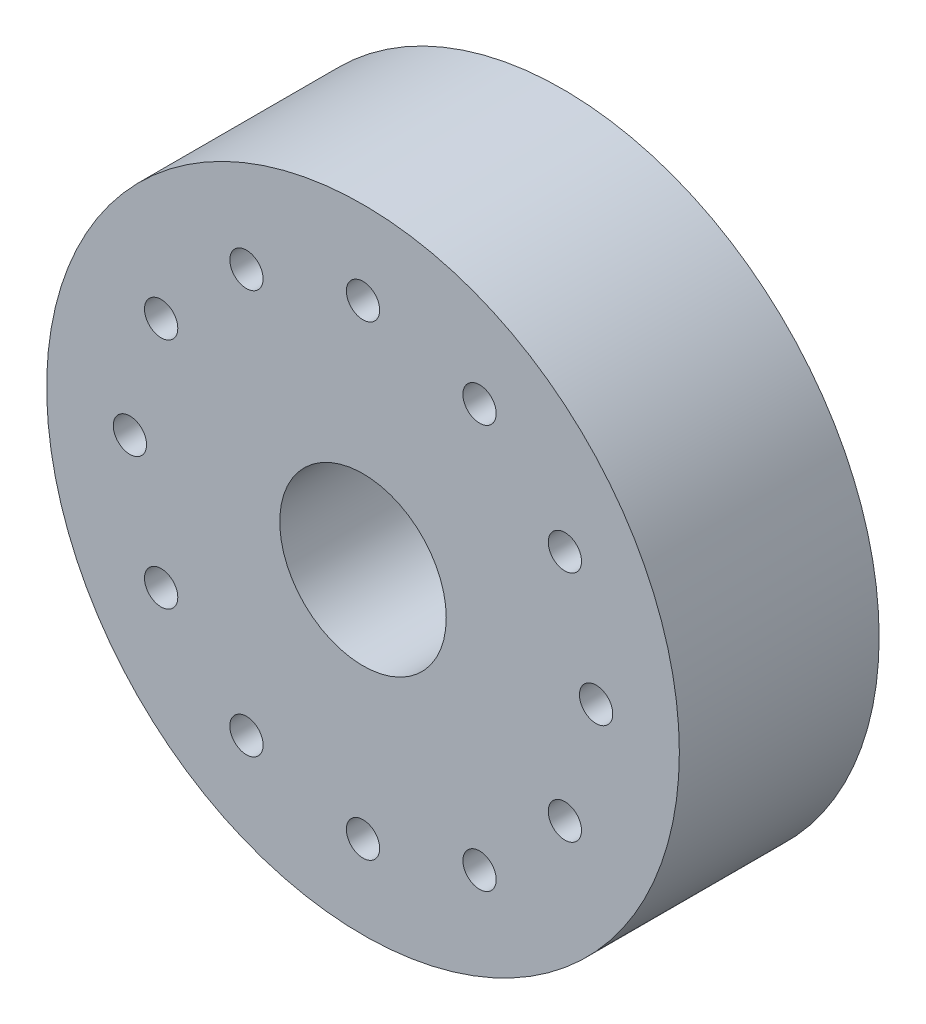
ISO-10303-21;
HEADER;
FILE_DESCRIPTION(('STEP AP214'),'2;1');
FILE_NAME('part.step','',(''),(''),'','','');
FILE_SCHEMA(('AUTOMOTIVE_DESIGN { 1 0 10303 214 1 1 1 1 }'));
ENDSEC;
DATA;
#1=APPLICATION_CONTEXT('core data for automotive mechanical design processes');
#2=APPLICATION_PROTOCOL_DEFINITION('international standard','automotive_design',2000,#1);
#3=PRODUCT_CONTEXT('',#1,'mechanical');
#4=PRODUCT('Part','Part','',(#3));
#5=PRODUCT_RELATED_PRODUCT_CATEGORY('part','',(#4));
#6=PRODUCT_DEFINITION_FORMATION('','',#4);
#7=PRODUCT_DEFINITION_CONTEXT('part definition',#1,'design');
#8=PRODUCT_DEFINITION('design','',#6,#7);
#9=PRODUCT_DEFINITION_SHAPE('','',#8);
#10=(LENGTH_UNIT() NAMED_UNIT(*) SI_UNIT(.MILLI.,.METRE.));
#11=(NAMED_UNIT(*) PLANE_ANGLE_UNIT() SI_UNIT($,.RADIAN.));
#12=(NAMED_UNIT(*) SI_UNIT($,.STERADIAN.) SOLID_ANGLE_UNIT());
#13=UNCERTAINTY_MEASURE_WITH_UNIT(LENGTH_MEASURE(1.E-05),#10,'distance_accuracy_value','');
#14=(GEOMETRIC_REPRESENTATION_CONTEXT(3) GLOBAL_UNCERTAINTY_ASSIGNED_CONTEXT((#13)) GLOBAL_UNIT_ASSIGNED_CONTEXT((#10,
#11,#12)) REPRESENTATION_CONTEXT('',''));
#15=CARTESIAN_POINT('',(0.,0.,0.));
#16=DIRECTION('',(0.,0.,1.));
#17=DIRECTION('',(1.,0.,0.));
#18=AXIS2_PLACEMENT_3D('',#15,#16,#17);
#19=CARTESIAN_POINT('',(0.,0.,6.));
#20=DIRECTION('',(0.,0.,1.));
#21=DIRECTION('',(1.,0.,0.));
#22=AXIS2_PLACEMENT_3D('',#19,#20,#21);
#23=PLANE('',#22);
#24=CARTESIAN_POINT('',(-6.06217782648988,3.49999999999793,6.));
#25=DIRECTION('',(0.,0.,1.));
#26=DIRECTION('',(1.,0.,0.));
#27=AXIS2_PLACEMENT_3D('',#24,#25,#26);
#28=CIRCLE('',#27,0.500000000001829);
#29=CARTESIAN_POINT('',(-5.56217782648805,3.49999999999793,6.));
#30=VERTEX_POINT('',#29);
#31=EDGE_CURVE('E107',#30,#30,#28,.T.);
#32=ORIENTED_EDGE('',*,*,#31,.F.);
#33=EDGE_LOOP('',(#32));
#34=FACE_BOUND('',#33,.T.);
#35=CARTESIAN_POINT('',(-6.06217782648749,-3.50000000000207,6.));
#36=DIRECTION('',(0.,0.,1.));
#37=DIRECTION('',(1.,0.,0.));
#38=AXIS2_PLACEMENT_3D('',#35,#36,#37);
#39=CIRCLE('',#38,0.500000000004095);
#40=CARTESIAN_POINT('',(-5.56217782648339,-3.50000000000207,6.));
#41=VERTEX_POINT('',#40);
#42=EDGE_CURVE('E95',#41,#41,#39,.T.);
#43=ORIENTED_EDGE('',*,*,#42,.F.);
#44=EDGE_LOOP('',(#43));
#45=FACE_BOUND('',#44,.T.);
#46=CARTESIAN_POINT('',(4.77313267878907E-12,-7.,6.));
#47=DIRECTION('',(0.,0.,1.));
#48=DIRECTION('',(1.,0.,0.));
#49=AXIS2_PLACEMENT_3D('',#46,#47,#48);
#50=CIRCLE('',#49,0.500000000004612);
#51=CARTESIAN_POINT('',(0.500000000009385,-7.,6.));
#52=VERTEX_POINT('',#51);
#53=EDGE_CURVE('E83',#52,#52,#50,.T.);
#54=ORIENTED_EDGE('',*,*,#53,.F.);
#55=EDGE_LOOP('',(#54));
#56=FACE_BOUND('',#55,.T.);
#57=CARTESIAN_POINT('',(6.06217782649465,-3.49999999999793,6.));
#58=DIRECTION('',(0.,0.,1.));
#59=DIRECTION('',(1.,0.,0.));
#60=AXIS2_PLACEMENT_3D('',#57,#58,#59);
#61=CIRCLE('',#60,0.500000000002852);
#62=CARTESIAN_POINT('',(6.5621778264975,-3.49999999999793,6.));
#63=VERTEX_POINT('',#62);
#64=EDGE_CURVE('E71',#63,#63,#61,.T.);
#65=ORIENTED_EDGE('',*,*,#64,.F.);
#66=EDGE_LOOP('',(#65));
#67=FACE_BOUND('',#66,.T.);
#68=CARTESIAN_POINT('',(6.06217782649226,3.50000000000207,6.));
#69=DIRECTION('',(0.,0.,1.));
#70=DIRECTION('',(1.,0.,0.));
#71=AXIS2_PLACEMENT_3D('',#68,#69,#70);
#72=CIRCLE('',#71,0.500000000000553);
#73=CARTESIAN_POINT('',(6.56217782649282,3.50000000000207,6.));
#74=VERTEX_POINT('',#73);
#75=EDGE_CURVE('E59',#74,#74,#72,.T.);
#76=ORIENTED_EDGE('',*,*,#75,.F.);
#77=EDGE_LOOP('',(#76));
#78=FACE_BOUND('',#77,.T.);
#79=CARTESIAN_POINT('',(0.,7.,6.));
#80=DIRECTION('',(0.,0.,1.));
#81=DIRECTION('',(1.,0.,0.));
#82=AXIS2_PLACEMENT_3D('',#79,#80,#81);
#83=CIRCLE('',#82,0.5);
#84=CARTESIAN_POINT('',(0.5,7.,6.));
#85=VERTEX_POINT('',#84);
#86=EDGE_CURVE('E47',#85,#85,#83,.T.);
#87=ORIENTED_EDGE('',*,*,#86,.F.);
#88=EDGE_LOOP('',(#87));
#89=FACE_BOUND('',#88,.T.);
#90=CARTESIAN_POINT('',(0.,0.,6.));
#91=DIRECTION('',(0.,0.,1.));
#92=DIRECTION('',(1.,0.,0.));
#93=AXIS2_PLACEMENT_3D('',#90,#91,#92);
#94=CIRCLE('',#93,9.5);
#95=CARTESIAN_POINT('',(9.5,0.,6.));
#96=VERTEX_POINT('',#95);
#97=EDGE_CURVE('E10',#96,#96,#94,.T.);
#98=ORIENTED_EDGE('',*,*,#97,.T.);
#99=EDGE_LOOP('',(#98));
#100=FACE_BOUND('',#99,.T.);
#101=CARTESIAN_POINT('',(0.,0.,6.));
#102=DIRECTION('',(0.,0.,1.));
#103=DIRECTION('',(1.,0.,0.));
#104=AXIS2_PLACEMENT_3D('',#101,#102,#103);
#105=CIRCLE('',#104,2.5);
#106=CARTESIAN_POINT('',(2.5,0.,6.));
#107=VERTEX_POINT('',#106);
#108=EDGE_CURVE('E42',#107,#107,#105,.T.);
#109=ORIENTED_EDGE('',*,*,#108,.F.);
#110=EDGE_LOOP('',(#109));
#111=FACE_BOUND('',#110,.T.);
#112=CARTESIAN_POINT('',(3.50000000000032,6.06217782649226,6.));
#113=DIRECTION('',(0.,0.,1.));
#114=DIRECTION('',(1.,0.,0.));
#115=AXIS2_PLACEMENT_3D('',#112,#113,#114);
#116=CIRCLE('',#115,0.499999999999963);
#117=CARTESIAN_POINT('',(4.00000000000028,6.06217782649226,6.));
#118=VERTEX_POINT('',#117);
#119=EDGE_CURVE('E53',#118,#118,#116,.T.);
#120=ORIENTED_EDGE('',*,*,#119,.F.);
#121=EDGE_LOOP('',(#120));
#122=FACE_BOUND('',#121,.T.);
#123=CARTESIAN_POINT('',(7.00000000000239,2.38656633939453E-12,6.));
#124=DIRECTION('',(0.,0.,1.));
#125=DIRECTION('',(1.,0.,0.));
#126=AXIS2_PLACEMENT_3D('',#123,#124,#125);
#127=CIRCLE('',#126,0.500000000001608);
#128=CARTESIAN_POINT('',(7.500000000004,2.38656633939453E-12,6.));
#129=VERTEX_POINT('',#128);
#130=EDGE_CURVE('E65',#129,#129,#127,.T.);
#131=ORIENTED_EDGE('',*,*,#130,.F.);
#132=EDGE_LOOP('',(#131));
#133=FACE_BOUND('',#132,.T.);
#134=CARTESIAN_POINT('',(3.50000000000445,-6.06217782648988,6.));
#135=DIRECTION('',(0.,0.,1.));
#136=DIRECTION('',(1.,0.,0.));
#137=AXIS2_PLACEMENT_3D('',#134,#135,#136);
#138=CIRCLE('',#137,0.500000000003953);
#139=CARTESIAN_POINT('',(4.00000000000841,-6.06217782648988,6.));
#140=VERTEX_POINT('',#139);
#141=EDGE_CURVE('E77',#140,#140,#138,.T.);
#142=ORIENTED_EDGE('',*,*,#141,.F.);
#143=EDGE_LOOP('',(#142));
#144=FACE_BOUND('',#143,.T.);
#145=CARTESIAN_POINT('',(-3.49999999999555,-6.06217782649226,6.));
#146=DIRECTION('',(0.,0.,1.));
#147=DIRECTION('',(1.,0.,0.));
#148=AXIS2_PLACEMENT_3D('',#145,#146,#147);
#149=CIRCLE('',#148,0.500000000004664);
#150=CARTESIAN_POINT('',(-2.99999999999088,-6.06217782649226,6.));
#151=VERTEX_POINT('',#150);
#152=EDGE_CURVE('E89',#151,#151,#149,.T.);
#153=ORIENTED_EDGE('',*,*,#152,.F.);
#154=EDGE_LOOP('',(#153));
#155=FACE_BOUND('',#154,.T.);
#156=CARTESIAN_POINT('',(-6.99999999999761,-2.38742359215394E-12,6.));
#157=DIRECTION('',(0.,0.,1.));
#158=DIRECTION('',(1.,0.,0.));
#159=AXIS2_PLACEMENT_3D('',#156,#157,#158);
#160=CIRCLE('',#159,0.500000000003051);
#161=CARTESIAN_POINT('',(-6.49999999999456,-2.38742359215394E-12,6.));
#162=VERTEX_POINT('',#161);
#163=EDGE_CURVE('E101',#162,#162,#160,.T.);
#164=ORIENTED_EDGE('',*,*,#163,.F.);
#165=EDGE_LOOP('',(#164));
#166=FACE_BOUND('',#165,.T.);
#167=CARTESIAN_POINT('',(-3.49999999999968,6.06217782648987,6.));
#168=DIRECTION('',(0.,0.,1.));
#169=DIRECTION('',(1.,0.,0.));
#170=AXIS2_PLACEMENT_3D('',#167,#168,#169);
#171=CIRCLE('',#170,0.500000000000745);
#172=CARTESIAN_POINT('',(-2.99999999999894,6.06217782648987,6.));
#173=VERTEX_POINT('',#172);
#174=EDGE_CURVE('E113',#173,#173,#171,.T.);
#175=ORIENTED_EDGE('',*,*,#174,.F.);
#176=EDGE_LOOP('',(#175));
#177=FACE_BOUND('',#176,.T.);
#178=ADVANCED_FACE('F31',(#34,#45,#56,#67,#78,#89,#100,#111,#122,#133,#144,#155,#166,#177),#23,.T.);
#179=CARTESIAN_POINT('',(0.,0.,0.));
#180=DIRECTION('',(0.,0.,1.));
#181=DIRECTION('',(1.,0.,0.));
#182=AXIS2_PLACEMENT_3D('',#179,#180,#181);
#183=PLANE('',#182);
#184=CARTESIAN_POINT('',(-6.06217782648988,3.49999999999793,0.));
#185=DIRECTION('',(0.,0.,1.));
#186=DIRECTION('',(1.,0.,0.));
#187=AXIS2_PLACEMENT_3D('',#184,#185,#186);
#188=CIRCLE('',#187,0.500000000001829);
#189=CARTESIAN_POINT('',(-5.56217782648805,3.49999999999793,0.));
#190=VERTEX_POINT('',#189);
#191=EDGE_CURVE('E110',#190,#190,#188,.T.);
#192=ORIENTED_EDGE('',*,*,#191,.T.);
#193=EDGE_LOOP('',(#192));
#194=FACE_BOUND('',#193,.T.);
#195=CARTESIAN_POINT('',(-6.06217782648749,-3.50000000000207,0.));
#196=DIRECTION('',(0.,0.,1.));
#197=DIRECTION('',(1.,0.,0.));
#198=AXIS2_PLACEMENT_3D('',#195,#196,#197);
#199=CIRCLE('',#198,0.500000000004095);
#200=CARTESIAN_POINT('',(-5.56217782648339,-3.50000000000207,0.));
#201=VERTEX_POINT('',#200);
#202=EDGE_CURVE('E98',#201,#201,#199,.T.);
#203=ORIENTED_EDGE('',*,*,#202,.T.);
#204=EDGE_LOOP('',(#203));
#205=FACE_BOUND('',#204,.T.);
#206=CARTESIAN_POINT('',(4.77313267878907E-12,-7.,0.));
#207=DIRECTION('',(0.,0.,1.));
#208=DIRECTION('',(1.,0.,0.));
#209=AXIS2_PLACEMENT_3D('',#206,#207,#208);
#210=CIRCLE('',#209,0.500000000004612);
#211=CARTESIAN_POINT('',(0.500000000009385,-7.,0.));
#212=VERTEX_POINT('',#211);
#213=EDGE_CURVE('E86',#212,#212,#210,.T.);
#214=ORIENTED_EDGE('',*,*,#213,.T.);
#215=EDGE_LOOP('',(#214));
#216=FACE_BOUND('',#215,.T.);
#217=CARTESIAN_POINT('',(6.06217782649465,-3.49999999999793,0.));
#218=DIRECTION('',(0.,0.,1.));
#219=DIRECTION('',(1.,0.,0.));
#220=AXIS2_PLACEMENT_3D('',#217,#218,#219);
#221=CIRCLE('',#220,0.500000000002852);
#222=CARTESIAN_POINT('',(6.5621778264975,-3.49999999999793,0.));
#223=VERTEX_POINT('',#222);
#224=EDGE_CURVE('E74',#223,#223,#221,.T.);
#225=ORIENTED_EDGE('',*,*,#224,.T.);
#226=EDGE_LOOP('',(#225));
#227=FACE_BOUND('',#226,.T.);
#228=CARTESIAN_POINT('',(6.06217782649226,3.50000000000207,0.));
#229=DIRECTION('',(0.,0.,1.));
#230=DIRECTION('',(1.,0.,0.));
#231=AXIS2_PLACEMENT_3D('',#228,#229,#230);
#232=CIRCLE('',#231,0.500000000000553);
#233=CARTESIAN_POINT('',(6.56217782649282,3.50000000000207,0.));
#234=VERTEX_POINT('',#233);
#235=EDGE_CURVE('E62',#234,#234,#232,.T.);
#236=ORIENTED_EDGE('',*,*,#235,.T.);
#237=EDGE_LOOP('',(#236));
#238=FACE_BOUND('',#237,.T.);
#239=CARTESIAN_POINT('',(0.,7.,0.));
#240=DIRECTION('',(0.,0.,1.));
#241=DIRECTION('',(1.,0.,0.));
#242=AXIS2_PLACEMENT_3D('',#239,#240,#241);
#243=CIRCLE('',#242,0.5);
#244=CARTESIAN_POINT('',(0.5,7.,0.));
#245=VERTEX_POINT('',#244);
#246=EDGE_CURVE('E50',#245,#245,#243,.T.);
#247=ORIENTED_EDGE('',*,*,#246,.T.);
#248=EDGE_LOOP('',(#247));
#249=FACE_BOUND('',#248,.T.);
#250=CARTESIAN_POINT('',(0.,0.,0.));
#251=DIRECTION('',(0.,0.,1.));
#252=DIRECTION('',(1.,0.,0.));
#253=AXIS2_PLACEMENT_3D('',#250,#251,#252);
#254=CIRCLE('',#253,9.5);
#255=CARTESIAN_POINT('',(9.5,0.,0.));
#256=VERTEX_POINT('',#255);
#257=EDGE_CURVE('E35',#256,#256,#254,.T.);
#258=ORIENTED_EDGE('',*,*,#257,.F.);
#259=EDGE_LOOP('',(#258));
#260=FACE_BOUND('',#259,.T.);
#261=CARTESIAN_POINT('',(0.,0.,0.));
#262=DIRECTION('',(0.,0.,1.));
#263=DIRECTION('',(1.,0.,0.));
#264=AXIS2_PLACEMENT_3D('',#261,#262,#263);
#265=CIRCLE('',#264,2.5);
#266=CARTESIAN_POINT('',(2.5,0.,0.));
#267=VERTEX_POINT('',#266);
#268=EDGE_CURVE('E44',#267,#267,#265,.T.);
#269=ORIENTED_EDGE('',*,*,#268,.T.);
#270=EDGE_LOOP('',(#269));
#271=FACE_BOUND('',#270,.T.);
#272=CARTESIAN_POINT('',(3.50000000000032,6.06217782649226,0.));
#273=DIRECTION('',(0.,0.,1.));
#274=DIRECTION('',(1.,0.,0.));
#275=AXIS2_PLACEMENT_3D('',#272,#273,#274);
#276=CIRCLE('',#275,0.499999999999963);
#277=CARTESIAN_POINT('',(4.00000000000028,6.06217782649226,0.));
#278=VERTEX_POINT('',#277);
#279=EDGE_CURVE('E56',#278,#278,#276,.T.);
#280=ORIENTED_EDGE('',*,*,#279,.T.);
#281=EDGE_LOOP('',(#280));
#282=FACE_BOUND('',#281,.T.);
#283=CARTESIAN_POINT('',(7.00000000000239,2.38656633939453E-12,0.));
#284=DIRECTION('',(0.,0.,1.));
#285=DIRECTION('',(1.,0.,0.));
#286=AXIS2_PLACEMENT_3D('',#283,#284,#285);
#287=CIRCLE('',#286,0.500000000001608);
#288=CARTESIAN_POINT('',(7.500000000004,2.38656633939453E-12,0.));
#289=VERTEX_POINT('',#288);
#290=EDGE_CURVE('E68',#289,#289,#287,.T.);
#291=ORIENTED_EDGE('',*,*,#290,.T.);
#292=EDGE_LOOP('',(#291));
#293=FACE_BOUND('',#292,.T.);
#294=CARTESIAN_POINT('',(3.50000000000445,-6.06217782648988,0.));
#295=DIRECTION('',(0.,0.,1.));
#296=DIRECTION('',(1.,0.,0.));
#297=AXIS2_PLACEMENT_3D('',#294,#295,#296);
#298=CIRCLE('',#297,0.500000000003953);
#299=CARTESIAN_POINT('',(4.00000000000841,-6.06217782648988,0.));
#300=VERTEX_POINT('',#299);
#301=EDGE_CURVE('E80',#300,#300,#298,.T.);
#302=ORIENTED_EDGE('',*,*,#301,.T.);
#303=EDGE_LOOP('',(#302));
#304=FACE_BOUND('',#303,.T.);
#305=CARTESIAN_POINT('',(-3.49999999999555,-6.06217782649226,0.));
#306=DIRECTION('',(0.,0.,1.));
#307=DIRECTION('',(1.,0.,0.));
#308=AXIS2_PLACEMENT_3D('',#305,#306,#307);
#309=CIRCLE('',#308,0.500000000004664);
#310=CARTESIAN_POINT('',(-2.99999999999088,-6.06217782649226,0.));
#311=VERTEX_POINT('',#310);
#312=EDGE_CURVE('E92',#311,#311,#309,.T.);
#313=ORIENTED_EDGE('',*,*,#312,.T.);
#314=EDGE_LOOP('',(#313));
#315=FACE_BOUND('',#314,.T.);
#316=CARTESIAN_POINT('',(-6.99999999999761,-2.38742359215394E-12,0.));
#317=DIRECTION('',(0.,0.,1.));
#318=DIRECTION('',(1.,0.,0.));
#319=AXIS2_PLACEMENT_3D('',#316,#317,#318);
#320=CIRCLE('',#319,0.500000000003051);
#321=CARTESIAN_POINT('',(-6.49999999999456,-2.38742359215394E-12,0.));
#322=VERTEX_POINT('',#321);
#323=EDGE_CURVE('E104',#322,#322,#320,.T.);
#324=ORIENTED_EDGE('',*,*,#323,.T.);
#325=EDGE_LOOP('',(#324));
#326=FACE_BOUND('',#325,.T.);
#327=CARTESIAN_POINT('',(-3.49999999999968,6.06217782648987,0.));
#328=DIRECTION('',(0.,0.,1.));
#329=DIRECTION('',(1.,0.,0.));
#330=AXIS2_PLACEMENT_3D('',#327,#328,#329);
#331=CIRCLE('',#330,0.500000000000745);
#332=CARTESIAN_POINT('',(-2.99999999999894,6.06217782648987,0.));
#333=VERTEX_POINT('',#332);
#334=EDGE_CURVE('E116',#333,#333,#331,.T.);
#335=ORIENTED_EDGE('',*,*,#334,.T.);
#336=EDGE_LOOP('',(#335));
#337=FACE_BOUND('',#336,.T.);
#338=ADVANCED_FACE('F126',(#194,#205,#216,#227,#238,#249,#260,#271,#282,#293,#304,#315,#326,
#337),#183,.F.);
#339=CARTESIAN_POINT('',(0.,0.,6.));
#340=DIRECTION('',(0.,0.,-1.));
#341=DIRECTION('',(-1.,0.,0.));
#342=AXIS2_PLACEMENT_3D('',#339,#340,#341);
#343=CYLINDRICAL_SURFACE('',#342,9.5);
#344=ORIENTED_EDGE('',*,*,#97,.F.);
#345=EDGE_LOOP('',(#344));
#346=FACE_BOUND('',#345,.T.);
#347=ORIENTED_EDGE('',*,*,#257,.T.);
#348=EDGE_LOOP('',(#347));
#349=FACE_BOUND('',#348,.T.);
#350=ADVANCED_FACE('F33',(#346,#349),#343,.T.);
#351=CARTESIAN_POINT('',(0.,0.,6.));
#352=DIRECTION('',(0.,0.,-1.));
#353=DIRECTION('',(-1.,0.,0.));
#354=AXIS2_PLACEMENT_3D('',#351,#352,#353);
#355=CYLINDRICAL_SURFACE('',#354,2.5);
#356=ORIENTED_EDGE('',*,*,#108,.T.);
#357=EDGE_LOOP('',(#356));
#358=FACE_BOUND('',#357,.T.);
#359=ORIENTED_EDGE('',*,*,#268,.F.);
#360=EDGE_LOOP('',(#359));
#361=FACE_BOUND('',#360,.T.);
#362=ADVANCED_FACE('F136',(#358,#361),#355,.F.);
#363=CARTESIAN_POINT('',(0.,7.,6.));
#364=DIRECTION('',(0.,0.,-1.));
#365=DIRECTION('',(-1.,0.,0.));
#366=AXIS2_PLACEMENT_3D('',#363,#364,#365);
#367=CYLINDRICAL_SURFACE('',#366,0.5);
#368=ORIENTED_EDGE('',*,*,#86,.T.);
#369=EDGE_LOOP('',(#368));
#370=FACE_BOUND('',#369,.T.);
#371=ORIENTED_EDGE('',*,*,#246,.F.);
#372=EDGE_LOOP('',(#371));
#373=FACE_BOUND('',#372,.T.);
#374=ADVANCED_FACE('F139',(#370,#373),#367,.F.);
#375=CARTESIAN_POINT('',(3.50000000000032,6.06217782649226,6.));
#376=DIRECTION('',(0.,0.,-1.));
#377=DIRECTION('',(-1.,0.,0.));
#378=AXIS2_PLACEMENT_3D('',#375,#376,#377);
#379=CYLINDRICAL_SURFACE('',#378,0.499999999999963);
#380=ORIENTED_EDGE('',*,*,#119,.T.);
#381=EDGE_LOOP('',(#380));
#382=FACE_BOUND('',#381,.T.);
#383=ORIENTED_EDGE('',*,*,#279,.F.);
#384=EDGE_LOOP('',(#383));
#385=FACE_BOUND('',#384,.T.);
#386=ADVANCED_FACE('F143',(#382,#385),#379,.F.);
#387=CARTESIAN_POINT('',(6.06217782649226,3.50000000000207,6.));
#388=DIRECTION('',(0.,0.,-1.));
#389=DIRECTION('',(-1.,0.,0.));
#390=AXIS2_PLACEMENT_3D('',#387,#388,#389);
#391=CYLINDRICAL_SURFACE('',#390,0.500000000000553);
#392=ORIENTED_EDGE('',*,*,#75,.T.);
#393=EDGE_LOOP('',(#392));
#394=FACE_BOUND('',#393,.T.);
#395=ORIENTED_EDGE('',*,*,#235,.F.);
#396=EDGE_LOOP('',(#395));
#397=FACE_BOUND('',#396,.T.);
#398=ADVANCED_FACE('F147',(#394,#397),#391,.F.);
#399=CARTESIAN_POINT('',(7.00000000000239,2.38656633939453E-12,6.));
#400=DIRECTION('',(0.,0.,-1.));
#401=DIRECTION('',(-1.,0.,0.));
#402=AXIS2_PLACEMENT_3D('',#399,#400,#401);
#403=CYLINDRICAL_SURFACE('',#402,0.500000000001608);
#404=ORIENTED_EDGE('',*,*,#130,.T.);
#405=EDGE_LOOP('',(#404));
#406=FACE_BOUND('',#405,.T.);
#407=ORIENTED_EDGE('',*,*,#290,.F.);
#408=EDGE_LOOP('',(#407));
#409=FACE_BOUND('',#408,.T.);
#410=ADVANCED_FACE('F151',(#406,#409),#403,.F.);
#411=CARTESIAN_POINT('',(6.06217782649465,-3.49999999999793,6.));
#412=DIRECTION('',(0.,0.,-1.));
#413=DIRECTION('',(-1.,0.,0.));
#414=AXIS2_PLACEMENT_3D('',#411,#412,#413);
#415=CYLINDRICAL_SURFACE('',#414,0.500000000002852);
#416=ORIENTED_EDGE('',*,*,#64,.T.);
#417=EDGE_LOOP('',(#416));
#418=FACE_BOUND('',#417,.T.);
#419=ORIENTED_EDGE('',*,*,#224,.F.);
#420=EDGE_LOOP('',(#419));
#421=FACE_BOUND('',#420,.T.);
#422=ADVANCED_FACE('F155',(#418,#421),#415,.F.);
#423=CARTESIAN_POINT('',(3.50000000000445,-6.06217782648988,6.));
#424=DIRECTION('',(0.,0.,-1.));
#425=DIRECTION('',(-1.,0.,0.));
#426=AXIS2_PLACEMENT_3D('',#423,#424,#425);
#427=CYLINDRICAL_SURFACE('',#426,0.500000000003953);
#428=ORIENTED_EDGE('',*,*,#141,.T.);
#429=EDGE_LOOP('',(#428));
#430=FACE_BOUND('',#429,.T.);
#431=ORIENTED_EDGE('',*,*,#301,.F.);
#432=EDGE_LOOP('',(#431));
#433=FACE_BOUND('',#432,.T.);
#434=ADVANCED_FACE('F159',(#430,#433),#427,.F.);
#435=CARTESIAN_POINT('',(4.77313267878907E-12,-7.,6.));
#436=DIRECTION('',(0.,0.,-1.));
#437=DIRECTION('',(-1.,0.,0.));
#438=AXIS2_PLACEMENT_3D('',#435,#436,#437);
#439=CYLINDRICAL_SURFACE('',#438,0.500000000004612);
#440=ORIENTED_EDGE('',*,*,#53,.T.);
#441=EDGE_LOOP('',(#440));
#442=FACE_BOUND('',#441,.T.);
#443=ORIENTED_EDGE('',*,*,#213,.F.);
#444=EDGE_LOOP('',(#443));
#445=FACE_BOUND('',#444,.T.);
#446=ADVANCED_FACE('F163',(#442,#445),#439,.F.);
#447=CARTESIAN_POINT('',(-3.49999999999555,-6.06217782649226,6.));
#448=DIRECTION('',(0.,0.,-1.));
#449=DIRECTION('',(-1.,0.,0.));
#450=AXIS2_PLACEMENT_3D('',#447,#448,#449);
#451=CYLINDRICAL_SURFACE('',#450,0.500000000004664);
#452=ORIENTED_EDGE('',*,*,#152,.T.);
#453=EDGE_LOOP('',(#452));
#454=FACE_BOUND('',#453,.T.);
#455=ORIENTED_EDGE('',*,*,#312,.F.);
#456=EDGE_LOOP('',(#455));
#457=FACE_BOUND('',#456,.T.);
#458=ADVANCED_FACE('F167',(#454,#457),#451,.F.);
#459=CARTESIAN_POINT('',(-6.06217782648749,-3.50000000000207,6.));
#460=DIRECTION('',(0.,0.,-1.));
#461=DIRECTION('',(-1.,0.,0.));
#462=AXIS2_PLACEMENT_3D('',#459,#460,#461);
#463=CYLINDRICAL_SURFACE('',#462,0.500000000004095);
#464=ORIENTED_EDGE('',*,*,#42,.T.);
#465=EDGE_LOOP('',(#464));
#466=FACE_BOUND('',#465,.T.);
#467=ORIENTED_EDGE('',*,*,#202,.F.);
#468=EDGE_LOOP('',(#467));
#469=FACE_BOUND('',#468,.T.);
#470=ADVANCED_FACE('F171',(#466,#469),#463,.F.);
#471=CARTESIAN_POINT('',(-6.99999999999761,-2.38742359215394E-12,6.));
#472=DIRECTION('',(0.,0.,-1.));
#473=DIRECTION('',(-1.,0.,0.));
#474=AXIS2_PLACEMENT_3D('',#471,#472,#473);
#475=CYLINDRICAL_SURFACE('',#474,0.500000000003051);
#476=ORIENTED_EDGE('',*,*,#163,.T.);
#477=EDGE_LOOP('',(#476));
#478=FACE_BOUND('',#477,.T.);
#479=ORIENTED_EDGE('',*,*,#323,.F.);
#480=EDGE_LOOP('',(#479));
#481=FACE_BOUND('',#480,.T.);
#482=ADVANCED_FACE('F175',(#478,#481),#475,.F.);
#483=CARTESIAN_POINT('',(-6.06217782648988,3.49999999999793,6.));
#484=DIRECTION('',(0.,0.,-1.));
#485=DIRECTION('',(-1.,0.,0.));
#486=AXIS2_PLACEMENT_3D('',#483,#484,#485);
#487=CYLINDRICAL_SURFACE('',#486,0.500000000001829);
#488=ORIENTED_EDGE('',*,*,#31,.T.);
#489=EDGE_LOOP('',(#488));
#490=FACE_BOUND('',#489,.T.);
#491=ORIENTED_EDGE('',*,*,#191,.F.);
#492=EDGE_LOOP('',(#491));
#493=FACE_BOUND('',#492,.T.);
#494=ADVANCED_FACE('F179',(#490,#493),#487,.F.);
#495=CARTESIAN_POINT('',(-3.49999999999968,6.06217782648987,6.));
#496=DIRECTION('',(0.,0.,-1.));
#497=DIRECTION('',(-1.,0.,0.));
#498=AXIS2_PLACEMENT_3D('',#495,#496,#497);
#499=CYLINDRICAL_SURFACE('',#498,0.500000000000745);
#500=ORIENTED_EDGE('',*,*,#174,.T.);
#501=EDGE_LOOP('',(#500));
#502=FACE_BOUND('',#501,.T.);
#503=ORIENTED_EDGE('',*,*,#334,.F.);
#504=EDGE_LOOP('',(#503));
#505=FACE_BOUND('',#504,.T.);
#506=ADVANCED_FACE('F122',(#502,#505),#499,.F.);
#507=CLOSED_SHELL('',(#178,#338,#350,#362,#374,#386,#398,#410,#422,#434,#446,#458,#470,#482,
#494,#506));
#508=MANIFOLD_SOLID_BREP('B2',#507);
#509=ADVANCED_BREP_SHAPE_REPRESENTATION('',(#18,#508),#14);
#510=SHAPE_DEFINITION_REPRESENTATION(#9,#509);
ENDSEC;
END-ISO-10303-21;
